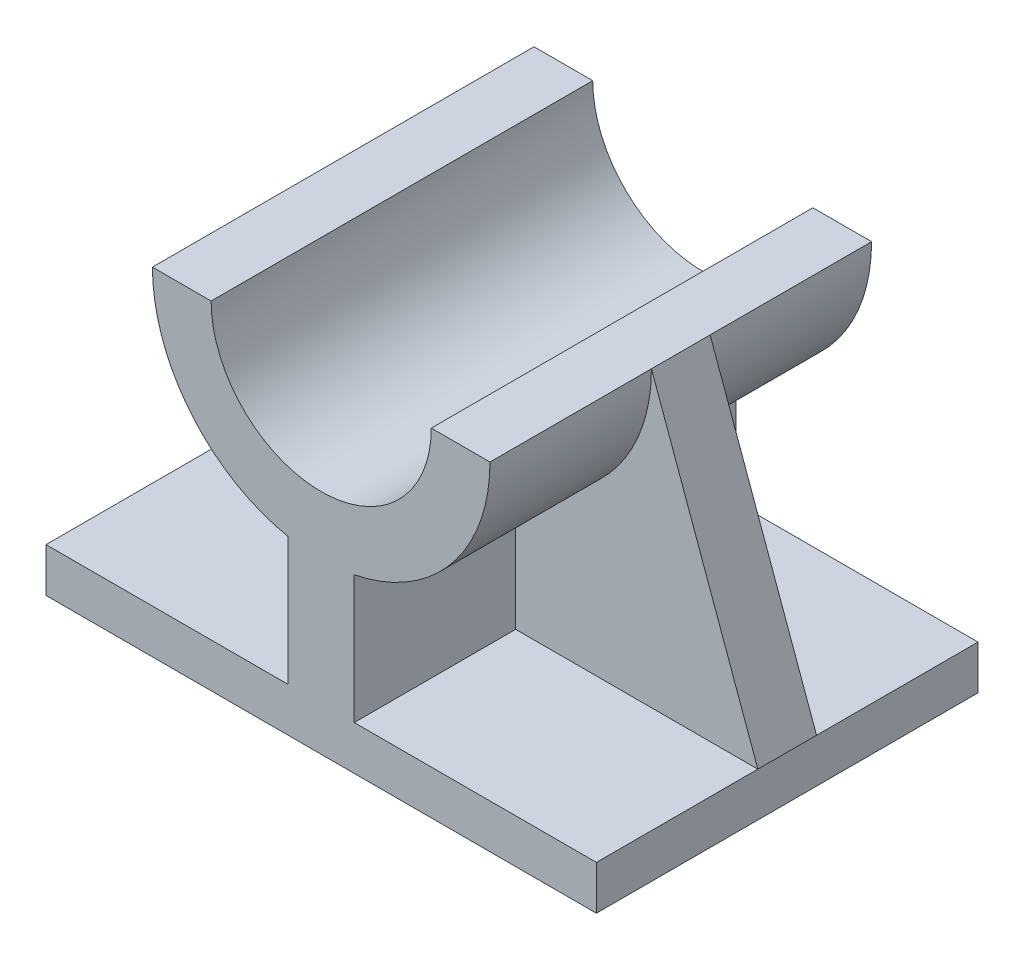
ISO-10303-21;
HEADER;
FILE_DESCRIPTION(('STEP AP214'),'2;1');
FILE_NAME('part.step','',(''),(''),'','','');
FILE_SCHEMA(('AUTOMOTIVE_DESIGN { 1 0 10303 214 1 1 1 1 }'));
ENDSEC;
DATA;
#1=APPLICATION_CONTEXT('core data for automotive mechanical design processes');
#2=APPLICATION_PROTOCOL_DEFINITION('international standard','automotive_design',2000,#1);
#3=PRODUCT_CONTEXT('',#1,'mechanical');
#4=PRODUCT('Part','Part','',(#3));
#5=PRODUCT_RELATED_PRODUCT_CATEGORY('part','',(#4));
#6=PRODUCT_DEFINITION_FORMATION('','',#4);
#7=PRODUCT_DEFINITION_CONTEXT('part definition',#1,'design');
#8=PRODUCT_DEFINITION('design','',#6,#7);
#9=PRODUCT_DEFINITION_SHAPE('','',#8);
#10=(LENGTH_UNIT() NAMED_UNIT(*) SI_UNIT(.MILLI.,.METRE.));
#11=(NAMED_UNIT(*) PLANE_ANGLE_UNIT() SI_UNIT($,.RADIAN.));
#12=(NAMED_UNIT(*) SI_UNIT($,.STERADIAN.) SOLID_ANGLE_UNIT());
#13=UNCERTAINTY_MEASURE_WITH_UNIT(LENGTH_MEASURE(1.E-05),#10,'distance_accuracy_value','');
#14=(GEOMETRIC_REPRESENTATION_CONTEXT(3) GLOBAL_UNCERTAINTY_ASSIGNED_CONTEXT((#13)) GLOBAL_UNIT_ASSIGNED_CONTEXT((#10,
#11,#12)) REPRESENTATION_CONTEXT('',''));
#15=CARTESIAN_POINT('',(0.,0.,0.));
#16=DIRECTION('',(0.,0.,1.));
#17=DIRECTION('',(1.,0.,0.));
#18=AXIS2_PLACEMENT_3D('',#15,#16,#17);
#19=CARTESIAN_POINT('',(4.5,0.,-52.));
#20=DIRECTION('',(1.,0.,0.));
#21=DIRECTION('',(0.,0.,-1.));
#22=AXIS2_PLACEMENT_3D('',#19,#20,#21);
#23=PLANE('',#22);
#24=DIRECTION('',(0.,0.,1.));
#25=VECTOR('',#24,1.);
#26=CARTESIAN_POINT('',(4.5,20.4445128627201,-52.));
#27=LINE('',#26,#25);
#28=CARTESIAN_POINT('',(4.5,20.4445128627201,-52.));
#29=VERTEX_POINT('',#28);
#30=CARTESIAN_POINT('',(4.5,20.4445128627201,-30.));
#31=VERTEX_POINT('',#30);
#32=EDGE_CURVE('E41',#29,#31,#27,.T.);
#33=ORIENTED_EDGE('',*,*,#32,.T.);
#34=DIRECTION('',(0.,1.,0.));
#35=VECTOR('',#34,1.);
#36=CARTESIAN_POINT('',(4.5,0.,-30.));
#37=LINE('',#36,#35);
#38=CARTESIAN_POINT('',(4.5,3.,-30.));
#39=VERTEX_POINT('',#38);
#40=EDGE_CURVE('E62',#39,#31,#37,.T.);
#41=ORIENTED_EDGE('',*,*,#40,.F.);
#42=DIRECTION('',(0.,0.,1.));
#43=VECTOR('',#42,1.);
#44=CARTESIAN_POINT('',(4.5,3.,-52.));
#45=LINE('',#44,#43);
#46=CARTESIAN_POINT('',(4.5,3.,-52.));
#47=VERTEX_POINT('',#46);
#48=EDGE_CURVE('E11',#47,#39,#45,.T.);
#49=ORIENTED_EDGE('',*,*,#48,.F.);
#50=DIRECTION('',(0.,1.,0.));
#51=VECTOR('',#50,1.);
#52=CARTESIAN_POINT('',(4.5,0.,-52.));
#53=LINE('',#52,#51);
#54=EDGE_CURVE('E185',#47,#29,#53,.T.);
#55=ORIENTED_EDGE('',*,*,#54,.T.);
#56=EDGE_LOOP('',(#33,#41,#49,#55));
#57=FACE_BOUND('',#56,.T.);
#58=ADVANCED_FACE('F37',(#57),#23,.T.);
#59=CARTESIAN_POINT('',(0.,3.,-52.));
#60=DIRECTION('',(0.,-1.,0.));
#61=DIRECTION('',(0.,0.,-1.));
#62=AXIS2_PLACEMENT_3D('',#59,#60,#61);
#63=PLANE('',#62);
#64=DIRECTION('',(-1.,0.,0.));
#65=VECTOR('',#64,1.);
#66=CARTESIAN_POINT('',(0.,3.,-30.));
#67=LINE('',#66,#65);
#68=CARTESIAN_POINT('',(37.5,3.,-30.));
#69=VERTEX_POINT('',#68);
#70=EDGE_CURVE('E184',#69,#39,#67,.T.);
#71=ORIENTED_EDGE('',*,*,#70,.F.);
#72=DIRECTION('',(0.,0.,1.));
#73=VECTOR('',#72,1.);
#74=CARTESIAN_POINT('',(37.5,3.,-52.));
#75=LINE('',#74,#73);
#76=CARTESIAN_POINT('',(37.5,3.,-52.));
#77=VERTEX_POINT('',#76);
#78=EDGE_CURVE('E239',#77,#69,#75,.T.);
#79=ORIENTED_EDGE('',*,*,#78,.F.);
#80=DIRECTION('',(1.,0.,0.));
#81=VECTOR('',#80,1.);
#82=CARTESIAN_POINT('',(0.,3.,-52.));
#83=LINE('',#82,#81);
#84=EDGE_CURVE('E162',#47,#77,#83,.T.);
#85=ORIENTED_EDGE('',*,*,#84,.F.);
#86=ORIENTED_EDGE('',*,*,#48,.T.);
#87=EDGE_LOOP('',(#71,#79,#85,#86));
#88=FACE_BOUND('',#87,.T.);
#89=ADVANCED_FACE('F289',(#88),#63,.F.);
#90=CARTESIAN_POINT('',(0.,43.,-52.));
#91=DIRECTION('',(0.,0.,1.));
#92=DIRECTION('',(1.,0.,0.));
#93=AXIS2_PLACEMENT_3D('',#90,#91,#92);
#94=CYLINDRICAL_SURFACE('',#93,23.);
#95=DIRECTION('',(0.,0.,1.));
#96=VECTOR('',#95,1.);
#97=CARTESIAN_POINT('',(23.,43.,-52.));
#98=LINE('',#97,#96);
#99=CARTESIAN_POINT('',(23.,43.,-52.));
#100=VERTEX_POINT('',#99);
#101=CARTESIAN_POINT('',(23.,43.,-30.));
#102=VERTEX_POINT('',#101);
#103=EDGE_CURVE('E261',#100,#102,#98,.T.);
#104=ORIENTED_EDGE('',*,*,#103,.T.);
#105=CARTESIAN_POINT('',(0.,43.,-30.));
#106=DIRECTION('',(0.,0.,1.));
#107=DIRECTION('',(1.,0.,0.));
#108=AXIS2_PLACEMENT_3D('',#105,#106,#107);
#109=CIRCLE('',#108,23.);
#110=EDGE_CURVE('E273',#31,#102,#109,.T.);
#111=ORIENTED_EDGE('',*,*,#110,.F.);
#112=ORIENTED_EDGE('',*,*,#32,.F.);
#113=CARTESIAN_POINT('',(0.,43.,-52.));
#114=DIRECTION('',(0.,0.,1.));
#115=DIRECTION('',(1.,0.,0.));
#116=AXIS2_PLACEMENT_3D('',#113,#114,#115);
#117=CIRCLE('',#116,23.);
#118=EDGE_CURVE('E188',#29,#100,#117,.T.);
#119=ORIENTED_EDGE('',*,*,#118,.T.);
#120=EDGE_LOOP('',(#104,#111,#112,#119));
#121=FACE_BOUND('',#120,.T.);
#122=ADVANCED_FACE('F293',(#121),#94,.T.);
#123=DIRECTION('',(0.,1.,0.));
#124=VECTOR('',#123,1.);
#125=CARTESIAN_POINT('',(4.5,0.,-22.));
#126=LINE('',#125,#124);
#127=CARTESIAN_POINT('',(4.5,3.,-22.));
#128=VERTEX_POINT('',#127);
#129=CARTESIAN_POINT('',(4.50000000000001,20.4445128627201,-22.));
#130=VERTEX_POINT('',#129);
#131=EDGE_CURVE('E164',#128,#130,#126,.T.);
#132=ORIENTED_EDGE('',*,*,#131,.T.);
#133=CARTESIAN_POINT('',(4.5,20.4445128627201,0.));
#134=VERTEX_POINT('',#133);
#135=EDGE_CURVE('E151',#130,#134,#27,.T.);
#136=ORIENTED_EDGE('',*,*,#135,.T.);
#137=DIRECTION('',(0.,1.,0.));
#138=VECTOR('',#137,1.);
#139=CARTESIAN_POINT('',(4.5,0.,0.));
#140=LINE('',#139,#138);
#141=CARTESIAN_POINT('',(4.5,3.,0.));
#142=VERTEX_POINT('',#141);
#143=EDGE_CURVE('E180',#142,#134,#140,.T.);
#144=ORIENTED_EDGE('',*,*,#143,.F.);
#145=EDGE_CURVE('E46',#128,#142,#45,.T.);
#146=ORIENTED_EDGE('',*,*,#145,.F.);
#147=EDGE_LOOP('',(#132,#136,#144,#146));
#148=FACE_BOUND('',#147,.T.);
#149=ADVANCED_FACE('F39',(#148),#23,.T.);
#150=CARTESIAN_POINT('',(37.5,3.,-22.));
#151=VERTEX_POINT('',#150);
#152=CARTESIAN_POINT('',(37.5,3.,0.));
#153=VERTEX_POINT('',#152);
#154=EDGE_CURVE('E242',#151,#153,#75,.T.);
#155=ORIENTED_EDGE('',*,*,#154,.F.);
#156=DIRECTION('',(-1.,0.,0.));
#157=VECTOR('',#156,1.);
#158=CARTESIAN_POINT('',(0.,3.,-22.));
#159=LINE('',#158,#157);
#160=EDGE_CURVE('E54',#151,#128,#159,.T.);
#161=ORIENTED_EDGE('',*,*,#160,.T.);
#162=ORIENTED_EDGE('',*,*,#145,.T.);
#163=DIRECTION('',(1.,0.,0.));
#164=VECTOR('',#163,1.);
#165=CARTESIAN_POINT('',(0.,3.,0.));
#166=LINE('',#165,#164);
#167=EDGE_CURVE('E189',#142,#153,#166,.T.);
#168=ORIENTED_EDGE('',*,*,#167,.T.);
#169=EDGE_LOOP('',(#155,#161,#162,#168));
#170=FACE_BOUND('',#169,.T.);
#171=ADVANCED_FACE('F299',(#170),#63,.F.);
#172=CARTESIAN_POINT('',(37.5,0.,-52.));
#173=DIRECTION('',(-1.,0.,0.));
#174=DIRECTION('',(0.,0.,1.));
#175=AXIS2_PLACEMENT_3D('',#172,#173,#174);
#176=PLANE('',#175);
#177=DIRECTION('',(0.,-1.,0.));
#178=VECTOR('',#177,1.);
#179=CARTESIAN_POINT('',(37.5,0.,0.));
#180=LINE('',#179,#178);
#181=CARTESIAN_POINT('',(37.5,-3.,0.));
#182=VERTEX_POINT('',#181);
#183=EDGE_CURVE('E236',#153,#182,#180,.T.);
#184=ORIENTED_EDGE('',*,*,#183,.T.);
#185=DIRECTION('',(0.,0.,1.));
#186=VECTOR('',#185,1.);
#187=CARTESIAN_POINT('',(37.5,-3.,-52.));
#188=LINE('',#187,#186);
#189=CARTESIAN_POINT('',(37.5,-3.,-52.));
#190=VERTEX_POINT('',#189);
#191=EDGE_CURVE('E243',#190,#182,#188,.T.);
#192=ORIENTED_EDGE('',*,*,#191,.F.);
#193=DIRECTION('',(0.,-1.,0.));
#194=VECTOR('',#193,1.);
#195=CARTESIAN_POINT('',(37.5,0.,-52.));
#196=LINE('',#195,#194);
#197=EDGE_CURVE('E211',#77,#190,#196,.T.);
#198=ORIENTED_EDGE('',*,*,#197,.F.);
#199=ORIENTED_EDGE('',*,*,#78,.T.);
#200=DIRECTION('',(0.,0.,1.));
#201=VECTOR('',#200,1.);
#202=CARTESIAN_POINT('',(37.5,3.,-30.));
#203=LINE('',#202,#201);
#204=EDGE_CURVE('E177',#69,#151,#203,.T.);
#205=ORIENTED_EDGE('',*,*,#204,.T.);
#206=ORIENTED_EDGE('',*,*,#154,.T.);
#207=EDGE_LOOP('',(#184,#192,#198,#199,#205,#206));
#208=FACE_BOUND('',#207,.T.);
#209=ADVANCED_FACE('F282',(#208),#176,.F.);
#210=CARTESIAN_POINT('',(0.,-3.,-52.));
#211=DIRECTION('',(0.,-1.,0.));
#212=DIRECTION('',(0.,0.,-1.));
#213=AXIS2_PLACEMENT_3D('',#210,#211,#212);
#214=PLANE('',#213);
#215=DIRECTION('',(1.,0.,0.));
#216=VECTOR('',#215,1.);
#217=CARTESIAN_POINT('',(0.,-3.,0.));
#218=LINE('',#217,#216);
#219=CARTESIAN_POINT('',(-37.5,-3.,0.));
#220=VERTEX_POINT('',#219);
#221=EDGE_CURVE('E233',#220,#182,#218,.T.);
#222=ORIENTED_EDGE('',*,*,#221,.F.);
#223=DIRECTION('',(0.,0.,1.));
#224=VECTOR('',#223,1.);
#225=CARTESIAN_POINT('',(-37.5,-3.,-52.));
#226=LINE('',#225,#224);
#227=CARTESIAN_POINT('',(-37.5,-3.,-52.));
#228=VERTEX_POINT('',#227);
#229=EDGE_CURVE('E245',#228,#220,#226,.T.);
#230=ORIENTED_EDGE('',*,*,#229,.F.);
#231=DIRECTION('',(1.,0.,0.));
#232=VECTOR('',#231,1.);
#233=CARTESIAN_POINT('',(0.,-3.,-52.));
#234=LINE('',#233,#232);
#235=EDGE_CURVE('E208',#228,#190,#234,.T.);
#236=ORIENTED_EDGE('',*,*,#235,.T.);
#237=ORIENTED_EDGE('',*,*,#191,.T.);
#238=EDGE_LOOP('',(#222,#230,#236,#237));
#239=FACE_BOUND('',#238,.T.);
#240=ADVANCED_FACE('F346',(#239),#214,.T.);
#241=CARTESIAN_POINT('',(-37.5,0.,-52.));
#242=DIRECTION('',(-1.,0.,0.));
#243=DIRECTION('',(0.,0.,1.));
#244=AXIS2_PLACEMENT_3D('',#241,#242,#243);
#245=PLANE('',#244);
#246=DIRECTION('',(0.,-1.,0.));
#247=VECTOR('',#246,1.);
#248=CARTESIAN_POINT('',(-37.5,0.,0.));
#249=LINE('',#248,#247);
#250=CARTESIAN_POINT('',(-37.5,3.,0.));
#251=VERTEX_POINT('',#250);
#252=EDGE_CURVE('E230',#251,#220,#249,.T.);
#253=ORIENTED_EDGE('',*,*,#252,.F.);
#254=DIRECTION('',(0.,0.,1.));
#255=VECTOR('',#254,1.);
#256=CARTESIAN_POINT('',(-37.5,3.,-52.));
#257=LINE('',#256,#255);
#258=CARTESIAN_POINT('',(-37.5,3.,-52.));
#259=VERTEX_POINT('',#258);
#260=EDGE_CURVE('E247',#259,#251,#257,.T.);
#261=ORIENTED_EDGE('',*,*,#260,.F.);
#262=DIRECTION('',(0.,-1.,0.));
#263=VECTOR('',#262,1.);
#264=CARTESIAN_POINT('',(-37.5,0.,-52.));
#265=LINE('',#264,#263);
#266=EDGE_CURVE('E205',#259,#228,#265,.T.);
#267=ORIENTED_EDGE('',*,*,#266,.T.);
#268=ORIENTED_EDGE('',*,*,#229,.T.);
#269=EDGE_LOOP('',(#253,#261,#267,#268));
#270=FACE_BOUND('',#269,.T.);
#271=ADVANCED_FACE('F473',(#270),#245,.T.);
#272=CARTESIAN_POINT('',(-4.5,3.,0.));
#273=VERTEX_POINT('',#272);
#274=EDGE_CURVE('E228',#251,#273,#166,.T.);
#275=ORIENTED_EDGE('',*,*,#274,.T.);
#276=DIRECTION('',(0.,0.,1.));
#277=VECTOR('',#276,1.);
#278=CARTESIAN_POINT('',(-4.5,3.,-52.));
#279=LINE('',#278,#277);
#280=CARTESIAN_POINT('',(-4.5,3.,-52.));
#281=VERTEX_POINT('',#280);
#282=EDGE_CURVE('E249',#281,#273,#279,.T.);
#283=ORIENTED_EDGE('',*,*,#282,.F.);
#284=EDGE_CURVE('E203',#259,#281,#83,.T.);
#285=ORIENTED_EDGE('',*,*,#284,.F.);
#286=ORIENTED_EDGE('',*,*,#260,.T.);
#287=EDGE_LOOP('',(#275,#283,#285,#286));
#288=FACE_BOUND('',#287,.T.);
#289=ADVANCED_FACE('F301',(#288),#63,.F.);
#290=CARTESIAN_POINT('',(-4.5,0.,-52.));
#291=DIRECTION('',(1.,0.,0.));
#292=DIRECTION('',(0.,0.,-1.));
#293=AXIS2_PLACEMENT_3D('',#290,#291,#292);
#294=PLANE('',#293);
#295=DIRECTION('',(0.,1.,0.));
#296=VECTOR('',#295,1.);
#297=CARTESIAN_POINT('',(-4.5,0.,0.));
#298=LINE('',#297,#296);
#299=CARTESIAN_POINT('',(-4.5,20.4445128627201,0.));
#300=VERTEX_POINT('',#299);
#301=EDGE_CURVE('E225',#273,#300,#298,.T.);
#302=ORIENTED_EDGE('',*,*,#301,.T.);
#303=DIRECTION('',(0.,0.,1.));
#304=VECTOR('',#303,1.);
#305=CARTESIAN_POINT('',(-4.5,20.4445128627201,-52.));
#306=LINE('',#305,#304);
#307=CARTESIAN_POINT('',(-4.5,20.4445128627201,-52.));
#308=VERTEX_POINT('',#307);
#309=EDGE_CURVE('E252',#308,#300,#306,.T.);
#310=ORIENTED_EDGE('',*,*,#309,.F.);
#311=DIRECTION('',(0.,1.,0.));
#312=VECTOR('',#311,1.);
#313=CARTESIAN_POINT('',(-4.5,0.,-52.));
#314=LINE('',#313,#312);
#315=EDGE_CURVE('E201',#281,#308,#314,.T.);
#316=ORIENTED_EDGE('',*,*,#315,.F.);
#317=ORIENTED_EDGE('',*,*,#282,.T.);
#318=EDGE_LOOP('',(#302,#310,#316,#317));
#319=FACE_BOUND('',#318,.T.);
#320=ADVANCED_FACE('F453',(#319),#294,.F.);
#321=CARTESIAN_POINT('',(0.,43.,-52.));
#322=DIRECTION('',(0.,0.,1.));
#323=DIRECTION('',(1.,0.,0.));
#324=AXIS2_PLACEMENT_3D('',#321,#322,#323);
#325=CYLINDRICAL_SURFACE('',#324,23.);
#326=CARTESIAN_POINT('',(0.,43.,0.));
#327=DIRECTION('',(0.,0.,1.));
#328=DIRECTION('',(1.,0.,0.));
#329=AXIS2_PLACEMENT_3D('',#326,#327,#328);
#330=CIRCLE('',#329,23.);
#331=CARTESIAN_POINT('',(-23.,43.,0.));
#332=VERTEX_POINT('',#331);
#333=EDGE_CURVE('E222',#332,#300,#330,.T.);
#334=ORIENTED_EDGE('',*,*,#333,.F.);
#335=DIRECTION('',(0.,0.,1.));
#336=VECTOR('',#335,1.);
#337=CARTESIAN_POINT('',(-23.,43.,-52.));
#338=LINE('',#337,#336);
#339=CARTESIAN_POINT('',(-23.,43.,-52.));
#340=VERTEX_POINT('',#339);
#341=EDGE_CURVE('E254',#340,#332,#338,.T.);
#342=ORIENTED_EDGE('',*,*,#341,.F.);
#343=CARTESIAN_POINT('',(0.,43.,-52.));
#344=DIRECTION('',(0.,0.,1.));
#345=DIRECTION('',(1.,0.,0.));
#346=AXIS2_PLACEMENT_3D('',#343,#344,#345);
#347=CIRCLE('',#346,23.);
#348=EDGE_CURVE('E198',#340,#308,#347,.T.);
#349=ORIENTED_EDGE('',*,*,#348,.T.);
#350=ORIENTED_EDGE('',*,*,#309,.T.);
#351=EDGE_LOOP('',(#334,#342,#349,#350));
#352=FACE_BOUND('',#351,.T.);
#353=ADVANCED_FACE('F443',(#352),#325,.T.);
#354=CARTESIAN_POINT('',(0.,43.,-52.));
#355=DIRECTION('',(0.,-1.,0.));
#356=DIRECTION('',(0.,0.,-1.));
#357=AXIS2_PLACEMENT_3D('',#354,#355,#356);
#358=PLANE('',#357);
#359=DIRECTION('',(1.,0.,0.));
#360=VECTOR('',#359,1.);
#361=CARTESIAN_POINT('',(0.,43.,0.));
#362=LINE('',#361,#360);
#363=CARTESIAN_POINT('',(-15.,43.,0.));
#364=VERTEX_POINT('',#363);
#365=EDGE_CURVE('E220',#332,#364,#362,.T.);
#366=ORIENTED_EDGE('',*,*,#365,.T.);
#367=DIRECTION('',(0.,0.,1.));
#368=VECTOR('',#367,1.);
#369=CARTESIAN_POINT('',(-15.,43.,-52.));
#370=LINE('',#369,#368);
#371=CARTESIAN_POINT('',(-15.,43.,-52.));
#372=VERTEX_POINT('',#371);
#373=EDGE_CURVE('E256',#372,#364,#370,.T.);
#374=ORIENTED_EDGE('',*,*,#373,.F.);
#375=DIRECTION('',(1.,0.,0.));
#376=VECTOR('',#375,1.);
#377=CARTESIAN_POINT('',(0.,43.,-52.));
#378=LINE('',#377,#376);
#379=EDGE_CURVE('E196',#340,#372,#378,.T.);
#380=ORIENTED_EDGE('',*,*,#379,.F.);
#381=ORIENTED_EDGE('',*,*,#341,.T.);
#382=EDGE_LOOP('',(#366,#374,#380,#381));
#383=FACE_BOUND('',#382,.T.);
#384=ADVANCED_FACE('F433',(#383),#358,.F.);
#385=CARTESIAN_POINT('',(0.,43.,-52.));
#386=DIRECTION('',(0.,0.,1.));
#387=DIRECTION('',(1.,0.,0.));
#388=AXIS2_PLACEMENT_3D('',#385,#386,#387);
#389=CYLINDRICAL_SURFACE('',#388,15.);
#390=CARTESIAN_POINT('',(0.,43.,0.));
#391=DIRECTION('',(0.,0.,1.));
#392=DIRECTION('',(1.,0.,0.));
#393=AXIS2_PLACEMENT_3D('',#390,#391,#392);
#394=CIRCLE('',#393,15.);
#395=CARTESIAN_POINT('',(15.,43.,0.));
#396=VERTEX_POINT('',#395);
#397=EDGE_CURVE('E218',#364,#396,#394,.T.);
#398=ORIENTED_EDGE('',*,*,#397,.T.);
#399=DIRECTION('',(0.,0.,1.));
#400=VECTOR('',#399,1.);
#401=CARTESIAN_POINT('',(15.,43.,-52.));
#402=LINE('',#401,#400);
#403=CARTESIAN_POINT('',(15.,43.,-52.));
#404=VERTEX_POINT('',#403);
#405=EDGE_CURVE('E259',#404,#396,#402,.T.);
#406=ORIENTED_EDGE('',*,*,#405,.F.);
#407=CARTESIAN_POINT('',(0.,43.,-52.));
#408=DIRECTION('',(0.,0.,1.));
#409=DIRECTION('',(1.,0.,0.));
#410=AXIS2_PLACEMENT_3D('',#407,#408,#409);
#411=CIRCLE('',#410,15.);
#412=EDGE_CURVE('E194',#372,#404,#411,.T.);
#413=ORIENTED_EDGE('',*,*,#412,.F.);
#414=ORIENTED_EDGE('',*,*,#373,.T.);
#415=EDGE_LOOP('',(#398,#406,#413,#414));
#416=FACE_BOUND('',#415,.T.);
#417=ADVANCED_FACE('F358',(#416),#389,.F.);
#418=CARTESIAN_POINT('',(0.,43.,-52.));
#419=DIRECTION('',(0.,-1.,0.));
#420=DIRECTION('',(0.,0.,-1.));
#421=AXIS2_PLACEMENT_3D('',#418,#419,#420);
#422=PLANE('',#421);
#423=DIRECTION('',(1.,0.,0.));
#424=VECTOR('',#423,1.);
#425=CARTESIAN_POINT('',(0.,43.,0.));
#426=LINE('',#425,#424);
#427=CARTESIAN_POINT('',(23.,43.,0.));
#428=VERTEX_POINT('',#427);
#429=EDGE_CURVE('E215',#396,#428,#426,.T.);
#430=ORIENTED_EDGE('',*,*,#429,.T.);
#431=CARTESIAN_POINT('',(23.,43.,-22.));
#432=VERTEX_POINT('',#431);
#433=EDGE_CURVE('E263',#432,#428,#98,.T.);
#434=ORIENTED_EDGE('',*,*,#433,.F.);
#435=DIRECTION('',(0.,0.,1.));
#436=VECTOR('',#435,1.);
#437=CARTESIAN_POINT('',(23.,43.,-30.));
#438=LINE('',#437,#436);
#439=EDGE_CURVE('E181',#102,#432,#438,.T.);
#440=ORIENTED_EDGE('',*,*,#439,.F.);
#441=ORIENTED_EDGE('',*,*,#103,.F.);
#442=DIRECTION('',(1.,0.,0.));
#443=VECTOR('',#442,1.);
#444=CARTESIAN_POINT('',(0.,43.,-52.));
#445=LINE('',#444,#443);
#446=EDGE_CURVE('E192',#404,#100,#445,.T.);
#447=ORIENTED_EDGE('',*,*,#446,.F.);
#448=ORIENTED_EDGE('',*,*,#405,.T.);
#449=EDGE_LOOP('',(#430,#434,#440,#441,#447,#448));
#450=FACE_BOUND('',#449,.T.);
#451=ADVANCED_FACE('F304',(#450),#422,.F.);
#452=CARTESIAN_POINT('',(0.,43.,-22.));
#453=DIRECTION('',(0.,0.,1.));
#454=DIRECTION('',(1.,0.,0.));
#455=AXIS2_PLACEMENT_3D('',#452,#453,#454);
#456=CIRCLE('',#455,23.);
#457=EDGE_CURVE('E155',#130,#432,#456,.T.);
#458=ORIENTED_EDGE('',*,*,#457,.T.);
#459=ORIENTED_EDGE('',*,*,#433,.T.);
#460=CARTESIAN_POINT('',(0.,43.,0.));
#461=DIRECTION('',(0.,0.,1.));
#462=DIRECTION('',(1.,0.,0.));
#463=AXIS2_PLACEMENT_3D('',#460,#461,#462);
#464=CIRCLE('',#463,23.);
#465=EDGE_CURVE('E158',#134,#428,#464,.T.);
#466=ORIENTED_EDGE('',*,*,#465,.F.);
#467=ORIENTED_EDGE('',*,*,#135,.F.);
#468=EDGE_LOOP('',(#458,#459,#466,#467));
#469=FACE_BOUND('',#468,.T.);
#470=ADVANCED_FACE('F153',(#469),#94,.T.);
#471=CARTESIAN_POINT('',(0.,0.,-52.));
#472=DIRECTION('',(0.,0.,1.));
#473=DIRECTION('',(1.,0.,0.));
#474=AXIS2_PLACEMENT_3D('',#471,#472,#473);
#475=PLANE('',#474);
#476=ORIENTED_EDGE('',*,*,#54,.F.);
#477=ORIENTED_EDGE('',*,*,#84,.T.);
#478=ORIENTED_EDGE('',*,*,#197,.T.);
#479=ORIENTED_EDGE('',*,*,#235,.F.);
#480=ORIENTED_EDGE('',*,*,#266,.F.);
#481=ORIENTED_EDGE('',*,*,#284,.T.);
#482=ORIENTED_EDGE('',*,*,#315,.T.);
#483=ORIENTED_EDGE('',*,*,#348,.F.);
#484=ORIENTED_EDGE('',*,*,#379,.T.);
#485=ORIENTED_EDGE('',*,*,#412,.T.);
#486=ORIENTED_EDGE('',*,*,#446,.T.);
#487=ORIENTED_EDGE('',*,*,#118,.F.);
#488=EDGE_LOOP('',(#476,#477,#478,#479,#480,#481,#482,#483,#484,#485,#486,#487));
#489=FACE_BOUND('',#488,.T.);
#490=ADVANCED_FACE('F291',(#489),#475,.F.);
#491=CARTESIAN_POINT('',(0.,0.,0.));
#492=DIRECTION('',(0.,0.,1.));
#493=DIRECTION('',(1.,0.,0.));
#494=AXIS2_PLACEMENT_3D('',#491,#492,#493);
#495=PLANE('',#494);
#496=ORIENTED_EDGE('',*,*,#143,.T.);
#497=ORIENTED_EDGE('',*,*,#465,.T.);
#498=ORIENTED_EDGE('',*,*,#429,.F.);
#499=ORIENTED_EDGE('',*,*,#397,.F.);
#500=ORIENTED_EDGE('',*,*,#365,.F.);
#501=ORIENTED_EDGE('',*,*,#333,.T.);
#502=ORIENTED_EDGE('',*,*,#301,.F.);
#503=ORIENTED_EDGE('',*,*,#274,.F.);
#504=ORIENTED_EDGE('',*,*,#252,.T.);
#505=ORIENTED_EDGE('',*,*,#221,.T.);
#506=ORIENTED_EDGE('',*,*,#183,.F.);
#507=ORIENTED_EDGE('',*,*,#167,.F.);
#508=EDGE_LOOP('',(#496,#497,#498,#499,#500,#501,#502,#503,#504,#505,#506,#507));
#509=FACE_BOUND('',#508,.T.);
#510=ADVANCED_FACE('F379',(#509),#495,.T.);
#511=CARTESIAN_POINT('',(34.1057864935782,12.3633476039221,-30.));
#512=DIRECTION('',(-0.940136065162483,-0.3407993236214,0.));
#513=DIRECTION('',(0.3407993236214,-0.940136065162483,0.));
#514=AXIS2_PLACEMENT_3D('',#511,#512,#513);
#515=PLANE('',#514);
#516=DIRECTION('',(0.3407993236214,-0.940136065162483,0.));
#517=VECTOR('',#516,1.);
#518=CARTESIAN_POINT('',(34.1057864935782,12.3633476039221,-22.));
#519=LINE('',#518,#517);
#520=EDGE_CURVE('E170',#432,#151,#519,.T.);
#521=ORIENTED_EDGE('',*,*,#520,.T.);
#522=ORIENTED_EDGE('',*,*,#204,.F.);
#523=DIRECTION('',(0.3407993236214,-0.940136065162483,0.));
#524=VECTOR('',#523,1.);
#525=CARTESIAN_POINT('',(34.1057864935782,12.3633476039221,-30.));
#526=LINE('',#525,#524);
#527=EDGE_CURVE('E176',#102,#69,#526,.T.);
#528=ORIENTED_EDGE('',*,*,#527,.F.);
#529=ORIENTED_EDGE('',*,*,#439,.T.);
#530=EDGE_LOOP('',(#521,#522,#528,#529));
#531=FACE_BOUND('',#530,.T.);
#532=ADVANCED_FACE('F280',(#531),#515,.F.);
#533=CARTESIAN_POINT('',(0.,0.,-30.));
#534=DIRECTION('',(0.,0.,1.));
#535=DIRECTION('',(1.,0.,0.));
#536=AXIS2_PLACEMENT_3D('',#533,#534,#535);
#537=PLANE('',#536);
#538=ORIENTED_EDGE('',*,*,#527,.T.);
#539=ORIENTED_EDGE('',*,*,#70,.T.);
#540=ORIENTED_EDGE('',*,*,#40,.T.);
#541=ORIENTED_EDGE('',*,*,#110,.T.);
#542=EDGE_LOOP('',(#538,#539,#540,#541));
#543=FACE_BOUND('',#542,.T.);
#544=ADVANCED_FACE('F272',(#543),#537,.F.);
#545=CARTESIAN_POINT('',(0.,0.,-22.));
#546=DIRECTION('',(0.,0.,1.));
#547=DIRECTION('',(1.,0.,0.));
#548=AXIS2_PLACEMENT_3D('',#545,#546,#547);
#549=PLANE('',#548);
#550=ORIENTED_EDGE('',*,*,#520,.F.);
#551=ORIENTED_EDGE('',*,*,#457,.F.);
#552=ORIENTED_EDGE('',*,*,#131,.F.);
#553=ORIENTED_EDGE('',*,*,#160,.F.);
#554=EDGE_LOOP('',(#550,#551,#552,#553));
#555=FACE_BOUND('',#554,.T.);
#556=ADVANCED_FACE('F168',(#555),#549,.T.);
#557=CLOSED_SHELL('',(#58,#89,#122,#149,#171,#209,#240,#271,#289,#320,#353,#384,#417,#451,#470,
#490,#510,#532,#544,#556));
#558=MANIFOLD_SOLID_BREP('B2',#557);
#559=ADVANCED_BREP_SHAPE_REPRESENTATION('',(#18,#558),#14);
#560=SHAPE_DEFINITION_REPRESENTATION(#9,#559);
ENDSEC;
END-ISO-10303-21;
